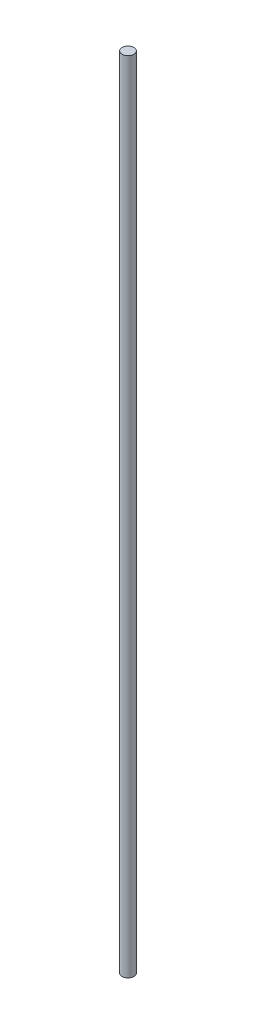
ISO-10303-21;
HEADER;
FILE_DESCRIPTION(('STEP AP214'),'2;1');
FILE_NAME('part.step','',(''),(''),'','','');
FILE_SCHEMA(('AUTOMOTIVE_DESIGN { 1 0 10303 214 1 1 1 1 }'));
ENDSEC;
DATA;
#1=APPLICATION_CONTEXT('core data for automotive mechanical design processes');
#2=APPLICATION_PROTOCOL_DEFINITION('international standard','automotive_design',2000,#1);
#3=PRODUCT_CONTEXT('',#1,'mechanical');
#4=PRODUCT('Part','Part','',(#3));
#5=PRODUCT_RELATED_PRODUCT_CATEGORY('part','',(#4));
#6=PRODUCT_DEFINITION_FORMATION('','',#4);
#7=PRODUCT_DEFINITION_CONTEXT('part definition',#1,'design');
#8=PRODUCT_DEFINITION('design','',#6,#7);
#9=PRODUCT_DEFINITION_SHAPE('','',#8);
#10=(LENGTH_UNIT() NAMED_UNIT(*) SI_UNIT(.MILLI.,.METRE.));
#11=(NAMED_UNIT(*) PLANE_ANGLE_UNIT() SI_UNIT($,.RADIAN.));
#12=(NAMED_UNIT(*) SI_UNIT($,.STERADIAN.) SOLID_ANGLE_UNIT());
#13=UNCERTAINTY_MEASURE_WITH_UNIT(LENGTH_MEASURE(1.E-05),#10,'distance_accuracy_value','');
#14=(GEOMETRIC_REPRESENTATION_CONTEXT(3) GLOBAL_UNCERTAINTY_ASSIGNED_CONTEXT((#13)) GLOBAL_UNIT_ASSIGNED_CONTEXT((#10,
#11,#12)) REPRESENTATION_CONTEXT('',''));
#15=CARTESIAN_POINT('',(0.,0.,0.));
#16=DIRECTION('',(0.,0.,1.));
#17=DIRECTION('',(1.,0.,0.));
#18=AXIS2_PLACEMENT_3D('',#15,#16,#17);
#19=CARTESIAN_POINT('',(0.,202.,0.));
#20=DIRECTION('',(0.,-1.,0.));
#21=DIRECTION('',(0.,0.,-1.));
#22=AXIS2_PLACEMENT_3D('',#19,#20,#21);
#23=CYLINDRICAL_SURFACE('',#22,1.5);
#24=CARTESIAN_POINT('',(0.,202.,0.));
#25=DIRECTION('',(0.,1.,0.));
#26=DIRECTION('',(0.,0.,1.));
#27=AXIS2_PLACEMENT_3D('',#24,#25,#26);
#28=CIRCLE('',#27,1.5);
#29=CARTESIAN_POINT('',(0.,202.,1.5));
#30=VERTEX_POINT('',#29);
#31=EDGE_CURVE('E10',#30,#30,#28,.T.);
#32=ORIENTED_EDGE('',*,*,#31,.F.);
#33=EDGE_LOOP('',(#32));
#34=FACE_BOUND('',#33,.T.);
#35=CARTESIAN_POINT('',(0.,0.,0.));
#36=DIRECTION('',(0.,1.,0.));
#37=DIRECTION('',(0.,0.,1.));
#38=AXIS2_PLACEMENT_3D('',#35,#36,#37);
#39=CIRCLE('',#38,1.5);
#40=CARTESIAN_POINT('',(0.,0.,1.5));
#41=VERTEX_POINT('',#40);
#42=EDGE_CURVE('E40',#41,#41,#39,.T.);
#43=ORIENTED_EDGE('',*,*,#42,.T.);
#44=EDGE_LOOP('',(#43));
#45=FACE_BOUND('',#44,.T.);
#46=ADVANCED_FACE('F37',(#34,#45),#23,.T.);
#47=CARTESIAN_POINT('',(0.,202.,0.));
#48=DIRECTION('',(0.,1.,0.));
#49=DIRECTION('',(0.,0.,1.));
#50=AXIS2_PLACEMENT_3D('',#47,#48,#49);
#51=PLANE('',#50);
#52=ORIENTED_EDGE('',*,*,#31,.T.);
#53=EDGE_LOOP('',(#52));
#54=FACE_BOUND('',#53,.T.);
#55=ADVANCED_FACE('F54',(#54),#51,.T.);
#56=CARTESIAN_POINT('',(0.,0.,0.));
#57=DIRECTION('',(0.,1.,0.));
#58=DIRECTION('',(0.,0.,1.));
#59=AXIS2_PLACEMENT_3D('',#56,#57,#58);
#60=PLANE('',#59);
#61=ORIENTED_EDGE('',*,*,#42,.F.);
#62=EDGE_LOOP('',(#61));
#63=FACE_BOUND('',#62,.T.);
#64=ADVANCED_FACE('F52',(#63),#60,.F.);
#65=CLOSED_SHELL('',(#46,#55,#64));
#66=MANIFOLD_SOLID_BREP('B2',#65);
#67=ADVANCED_BREP_SHAPE_REPRESENTATION('',(#18,#66),#14);
#68=SHAPE_DEFINITION_REPRESENTATION(#9,#67);
ENDSEC;
END-ISO-10303-21;
